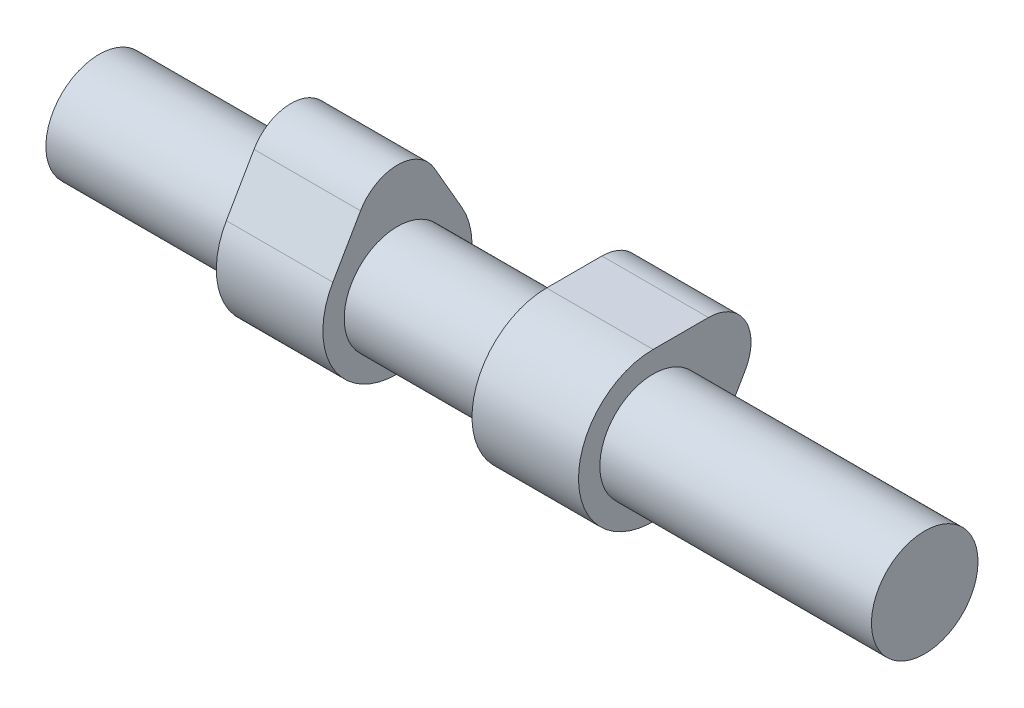
ISO-10303-21;
HEADER;
FILE_DESCRIPTION(('STEP AP214'),'2;1');
FILE_NAME('part.step','',(''),(''),'','','');
FILE_SCHEMA(('AUTOMOTIVE_DESIGN { 1 0 10303 214 1 1 1 1 }'));
ENDSEC;
DATA;
#1=APPLICATION_CONTEXT('core data for automotive mechanical design processes');
#2=APPLICATION_PROTOCOL_DEFINITION('international standard','automotive_design',2000,#1);
#3=PRODUCT_CONTEXT('',#1,'mechanical');
#4=PRODUCT('Part','Part','',(#3));
#5=PRODUCT_RELATED_PRODUCT_CATEGORY('part','',(#4));
#6=PRODUCT_DEFINITION_FORMATION('','',#4);
#7=PRODUCT_DEFINITION_CONTEXT('part definition',#1,'design');
#8=PRODUCT_DEFINITION('design','',#6,#7);
#9=PRODUCT_DEFINITION_SHAPE('','',#8);
#10=(LENGTH_UNIT() NAMED_UNIT(*) SI_UNIT(.MILLI.,.METRE.));
#11=(NAMED_UNIT(*) PLANE_ANGLE_UNIT() SI_UNIT($,.RADIAN.));
#12=(NAMED_UNIT(*) SI_UNIT($,.STERADIAN.) SOLID_ANGLE_UNIT());
#13=UNCERTAINTY_MEASURE_WITH_UNIT(LENGTH_MEASURE(1.E-05),#10,'distance_accuracy_value','');
#14=(GEOMETRIC_REPRESENTATION_CONTEXT(3) GLOBAL_UNCERTAINTY_ASSIGNED_CONTEXT((#13)) GLOBAL_UNIT_ASSIGNED_CONTEXT((#10,
#11,#12)) REPRESENTATION_CONTEXT('',''));
#15=CARTESIAN_POINT('',(0.,0.,0.));
#16=DIRECTION('',(0.,0.,1.));
#17=DIRECTION('',(1.,0.,0.));
#18=AXIS2_PLACEMENT_3D('',#15,#16,#17);
#19=CARTESIAN_POINT('',(-52.,0.,0.));
#20=DIRECTION('',(1.,0.,0.));
#21=DIRECTION('',(0.,0.,-1.));
#22=AXIS2_PLACEMENT_3D('',#19,#20,#21);
#23=CYLINDRICAL_SURFACE('',#22,5.);
#24=CARTESIAN_POINT('',(0.,0.,0.));
#25=DIRECTION('',(1.,0.,0.));
#26=DIRECTION('',(0.,0.,-1.));
#27=AXIS2_PLACEMENT_3D('',#24,#25,#26);
#28=CIRCLE('',#27,5.);
#29=CARTESIAN_POINT('',(0.,0.,-5.));
#30=VERTEX_POINT('',#29);
#31=EDGE_CURVE('E169',#30,#30,#28,.T.);
#32=ORIENTED_EDGE('',*,*,#31,.T.);
#33=EDGE_LOOP('',(#32));
#34=FACE_BOUND('',#33,.T.);
#35=CARTESIAN_POINT('',(25.5,0.,0.));
#36=DIRECTION('',(1.,0.,0.));
#37=DIRECTION('',(0.,0.,-1.));
#38=AXIS2_PLACEMENT_3D('',#35,#36,#37);
#39=CIRCLE('',#38,5.);
#40=CARTESIAN_POINT('',(25.5,0.,-5.));
#41=VERTEX_POINT('',#40);
#42=EDGE_CURVE('E151',#41,#41,#39,.T.);
#43=ORIENTED_EDGE('',*,*,#42,.F.);
#44=EDGE_LOOP('',(#43));
#45=FACE_BOUND('',#44,.T.);
#46=ADVANCED_FACE('F41',(#34,#45),#23,.T.);
#47=CARTESIAN_POINT('',(-10.,-3.50000000000002,-6.06217782649106));
#48=DIRECTION('',(0.,-0.500000000000002,-0.866025403784437));
#49=DIRECTION('',(0.,0.866025403784437,-0.500000000000002));
#50=AXIS2_PLACEMENT_3D('',#47,#48,#49);
#51=PLANE('',#50);
#52=DIRECTION('',(0.,0.866025403784437,-0.500000000000002));
#53=VECTOR('',#52,1.);
#54=CARTESIAN_POINT('',(0.,-3.50000000000002,-6.06217782649106));
#55=LINE('',#54,#53);
#56=CARTESIAN_POINT('',(0.,-3.50000000000001,-6.06217782649106));
#57=VERTEX_POINT('',#56);
#58=CARTESIAN_POINT('',(0.,0.999999999999979,-8.66025403784439));
#59=VERTEX_POINT('',#58);
#60=EDGE_CURVE('E179',#57,#59,#55,.T.);
#61=ORIENTED_EDGE('',*,*,#60,.F.);
#62=DIRECTION('',(1.,0.,0.));
#63=VECTOR('',#62,1.);
#64=CARTESIAN_POINT('',(-10.,-3.50000000000001,-6.06217782649106));
#65=LINE('',#64,#63);
#66=CARTESIAN_POINT('',(-10.,-3.50000000000001,-6.06217782649106));
#67=VERTEX_POINT('',#66);
#68=EDGE_CURVE('E49',#67,#57,#65,.T.);
#69=ORIENTED_EDGE('',*,*,#68,.F.);
#70=DIRECTION('',(0.,0.866025403784437,-0.500000000000002));
#71=VECTOR('',#70,1.);
#72=CARTESIAN_POINT('',(-10.,-3.50000000000002,-6.06217782649106));
#73=LINE('',#72,#71);
#74=CARTESIAN_POINT('',(-10.,0.999999999999979,-8.66025403784439));
#75=VERTEX_POINT('',#74);
#76=EDGE_CURVE('E166',#67,#75,#73,.T.);
#77=ORIENTED_EDGE('',*,*,#76,.T.);
#78=DIRECTION('',(1.,0.,0.));
#79=VECTOR('',#78,1.);
#80=CARTESIAN_POINT('',(-10.,0.999999999999979,-8.66025403784439));
#81=LINE('',#80,#79);
#82=EDGE_CURVE('E88',#75,#59,#81,.T.);
#83=ORIENTED_EDGE('',*,*,#82,.T.);
#84=EDGE_LOOP('',(#61,#69,#77,#83));
#85=FACE_BOUND('',#84,.T.);
#86=ADVANCED_FACE('F43',(#85),#51,.T.);
#87=CARTESIAN_POINT('',(-10.,0.,0.));
#88=DIRECTION('',(1.,0.,0.));
#89=DIRECTION('',(0.,0.,-1.));
#90=AXIS2_PLACEMENT_3D('',#87,#88,#89);
#91=CYLINDRICAL_SURFACE('',#90,7.);
#92=CARTESIAN_POINT('',(0.,0.,0.));
#93=DIRECTION('',(1.,0.,0.));
#94=DIRECTION('',(0.,0.,-1.));
#95=AXIS2_PLACEMENT_3D('',#92,#93,#94);
#96=CIRCLE('',#95,7.);
#97=CARTESIAN_POINT('',(0.,7.,0.));
#98=VERTEX_POINT('',#97);
#99=EDGE_CURVE('E171',#98,#57,#96,.T.);
#100=ORIENTED_EDGE('',*,*,#99,.F.);
#101=DIRECTION('',(1.,0.,0.));
#102=VECTOR('',#101,1.);
#103=CARTESIAN_POINT('',(-10.,7.,0.));
#104=LINE('',#103,#102);
#105=CARTESIAN_POINT('',(-10.,7.,0.));
#106=VERTEX_POINT('',#105);
#107=EDGE_CURVE('E73',#106,#98,#104,.T.);
#108=ORIENTED_EDGE('',*,*,#107,.F.);
#109=CARTESIAN_POINT('',(-10.,0.,0.));
#110=DIRECTION('',(1.,0.,0.));
#111=DIRECTION('',(0.,0.,-1.));
#112=AXIS2_PLACEMENT_3D('',#109,#110,#111);
#113=CIRCLE('',#112,7.);
#114=EDGE_CURVE('E176',#106,#67,#113,.T.);
#115=ORIENTED_EDGE('',*,*,#114,.T.);
#116=ORIENTED_EDGE('',*,*,#68,.T.);
#117=EDGE_LOOP('',(#100,#108,#115,#116));
#118=FACE_BOUND('',#117,.T.);
#119=ADVANCED_FACE('F197',(#118),#91,.T.);
#120=CARTESIAN_POINT('',(-10.,7.,0.));
#121=DIRECTION('',(0.,-1.,0.));
#122=DIRECTION('',(0.,0.,-1.));
#123=AXIS2_PLACEMENT_3D('',#120,#121,#122);
#124=PLANE('',#123);
#125=DIRECTION('',(0.,0.,-1.));
#126=VECTOR('',#125,1.);
#127=CARTESIAN_POINT('',(0.,7.,0.));
#128=LINE('',#127,#126);
#129=CARTESIAN_POINT('',(0.,6.99999999999999,-5.19615242270665));
#130=VERTEX_POINT('',#129);
#131=EDGE_CURVE('E189',#98,#130,#128,.T.);
#132=ORIENTED_EDGE('',*,*,#131,.T.);
#133=DIRECTION('',(1.,0.,0.));
#134=VECTOR('',#133,1.);
#135=CARTESIAN_POINT('',(-10.,6.99999999999999,-5.19615242270665));
#136=LINE('',#135,#134);
#137=CARTESIAN_POINT('',(-10.,6.99999999999999,-5.19615242270665));
#138=VERTEX_POINT('',#137);
#139=EDGE_CURVE('E195',#138,#130,#136,.T.);
#140=ORIENTED_EDGE('',*,*,#139,.F.);
#141=DIRECTION('',(0.,0.,-1.));
#142=VECTOR('',#141,1.);
#143=CARTESIAN_POINT('',(-10.,7.,0.));
#144=LINE('',#143,#142);
#145=EDGE_CURVE('E173',#106,#138,#144,.T.);
#146=ORIENTED_EDGE('',*,*,#145,.F.);
#147=ORIENTED_EDGE('',*,*,#107,.T.);
#148=EDGE_LOOP('',(#132,#140,#146,#147));
#149=FACE_BOUND('',#148,.T.);
#150=ADVANCED_FACE('F200',(#149),#124,.F.);
#151=CARTESIAN_POINT('',(-10.,2.99999999999999,-5.19615242270664));
#152=DIRECTION('',(1.,0.,0.));
#153=DIRECTION('',(0.,0.,-1.));
#154=AXIS2_PLACEMENT_3D('',#151,#152,#153);
#155=CYLINDRICAL_SURFACE('',#154,4.);
#156=CARTESIAN_POINT('',(0.,2.99999999999999,-5.19615242270664));
#157=DIRECTION('',(1.,0.,0.));
#158=DIRECTION('',(0.,0.,-1.));
#159=AXIS2_PLACEMENT_3D('',#156,#157,#158);
#160=CIRCLE('',#159,4.);
#161=EDGE_CURVE('E181',#59,#130,#160,.T.);
#162=ORIENTED_EDGE('',*,*,#161,.F.);
#163=ORIENTED_EDGE('',*,*,#82,.F.);
#164=CARTESIAN_POINT('',(-10.,2.99999999999999,-5.19615242270664));
#165=DIRECTION('',(1.,0.,0.));
#166=DIRECTION('',(0.,0.,-1.));
#167=AXIS2_PLACEMENT_3D('',#164,#165,#166);
#168=CIRCLE('',#167,4.);
#169=EDGE_CURVE('E174',#75,#138,#168,.T.);
#170=ORIENTED_EDGE('',*,*,#169,.T.);
#171=ORIENTED_EDGE('',*,*,#139,.T.);
#172=EDGE_LOOP('',(#162,#163,#170,#171));
#173=FACE_BOUND('',#172,.T.);
#174=ADVANCED_FACE('F193',(#173),#155,.T.);
#175=CARTESIAN_POINT('',(-10.,0.,0.));
#176=DIRECTION('',(1.,0.,0.));
#177=DIRECTION('',(0.,0.,-1.));
#178=AXIS2_PLACEMENT_3D('',#175,#176,#177);
#179=PLANE('',#178);
#180=CARTESIAN_POINT('',(-10.,0.,0.));
#181=DIRECTION('',(1.,0.,0.));
#182=DIRECTION('',(0.,0.,-1.));
#183=AXIS2_PLACEMENT_3D('',#180,#181,#182);
#184=CIRCLE('',#183,5.);
#185=CARTESIAN_POINT('',(-10.,0.,-5.));
#186=VERTEX_POINT('',#185);
#187=EDGE_CURVE('E164',#186,#186,#184,.T.);
#188=ORIENTED_EDGE('',*,*,#187,.T.);
#189=EDGE_LOOP('',(#188));
#190=FACE_BOUND('',#189,.T.);
#191=ORIENTED_EDGE('',*,*,#76,.F.);
#192=ORIENTED_EDGE('',*,*,#114,.F.);
#193=ORIENTED_EDGE('',*,*,#145,.T.);
#194=ORIENTED_EDGE('',*,*,#169,.F.);
#195=EDGE_LOOP('',(#191,#192,#193,#194));
#196=FACE_BOUND('',#195,.T.);
#197=ADVANCED_FACE('F203',(#190,#196),#179,.F.);
#198=CARTESIAN_POINT('',(0.,0.,0.));
#199=DIRECTION('',(1.,0.,0.));
#200=DIRECTION('',(0.,0.,-1.));
#201=AXIS2_PLACEMENT_3D('',#198,#199,#200);
#202=PLANE('',#201);
#203=ORIENTED_EDGE('',*,*,#31,.F.);
#204=EDGE_LOOP('',(#203));
#205=FACE_BOUND('',#204,.T.);
#206=ORIENTED_EDGE('',*,*,#60,.T.);
#207=ORIENTED_EDGE('',*,*,#161,.T.);
#208=ORIENTED_EDGE('',*,*,#131,.F.);
#209=ORIENTED_EDGE('',*,*,#99,.T.);
#210=EDGE_LOOP('',(#206,#207,#208,#209));
#211=FACE_BOUND('',#210,.T.);
#212=ADVANCED_FACE('F198',(#205,#211),#202,.T.);
#213=CARTESIAN_POINT('',(-24.,0.,0.));
#214=DIRECTION('',(1.,0.,0.));
#215=DIRECTION('',(0.,0.,-1.));
#216=AXIS2_PLACEMENT_3D('',#213,#214,#215);
#217=CIRCLE('',#216,5.);
#218=CARTESIAN_POINT('',(-24.,0.,-5.));
#219=VERTEX_POINT('',#218);
#220=EDGE_CURVE('E11',#219,#219,#217,.F.);
#221=ORIENTED_EDGE('',*,*,#220,.F.);
#222=EDGE_LOOP('',(#221));
#223=FACE_BOUND('',#222,.T.);
#224=ORIENTED_EDGE('',*,*,#187,.F.);
#225=EDGE_LOOP('',(#224));
#226=FACE_BOUND('',#225,.T.);
#227=ADVANCED_FACE('F207',(#223,#226),#23,.T.);
#228=CARTESIAN_POINT('',(-34.,3.5,-6.06217782649107));
#229=DIRECTION('',(0.,0.5,-0.866025403784439));
#230=DIRECTION('',(0.,0.866025403784439,0.5));
#231=AXIS2_PLACEMENT_3D('',#228,#229,#230);
#232=PLANE('',#231);
#233=DIRECTION('',(0.,0.866025403784439,0.5));
#234=VECTOR('',#233,1.);
#235=CARTESIAN_POINT('',(-24.,3.5,-6.06217782649107));
#236=LINE('',#235,#234);
#237=CARTESIAN_POINT('',(-24.,3.5,-6.06217782649107));
#238=VERTEX_POINT('',#237);
#239=CARTESIAN_POINT('',(-24.,8.,-3.46410161513776));
#240=VERTEX_POINT('',#239);
#241=EDGE_CURVE('E149',#238,#240,#236,.T.);
#242=ORIENTED_EDGE('',*,*,#241,.F.);
#243=DIRECTION('',(1.,0.,0.));
#244=VECTOR('',#243,1.);
#245=CARTESIAN_POINT('',(-34.,3.5,-6.06217782649107));
#246=LINE('',#245,#244);
#247=CARTESIAN_POINT('',(-34.,3.5,-6.06217782649107));
#248=VERTEX_POINT('',#247);
#249=EDGE_CURVE('E137',#248,#238,#246,.T.);
#250=ORIENTED_EDGE('',*,*,#249,.F.);
#251=DIRECTION('',(0.,0.866025403784439,0.5));
#252=VECTOR('',#251,1.);
#253=CARTESIAN_POINT('',(-34.,3.5,-6.06217782649107));
#254=LINE('',#253,#252);
#255=CARTESIAN_POINT('',(-34.,8.,-3.46410161513776));
#256=VERTEX_POINT('',#255);
#257=EDGE_CURVE('E131',#248,#256,#254,.T.);
#258=ORIENTED_EDGE('',*,*,#257,.T.);
#259=DIRECTION('',(1.,0.,0.));
#260=VECTOR('',#259,1.);
#261=CARTESIAN_POINT('',(-34.,8.,-3.46410161513776));
#262=LINE('',#261,#260);
#263=EDGE_CURVE('E113',#256,#240,#262,.T.);
#264=ORIENTED_EDGE('',*,*,#263,.T.);
#265=EDGE_LOOP('',(#242,#250,#258,#264));
#266=FACE_BOUND('',#265,.T.);
#267=ADVANCED_FACE('F138',(#266),#232,.T.);
#268=CARTESIAN_POINT('',(-34.,0.,0.));
#269=DIRECTION('',(1.,0.,0.));
#270=DIRECTION('',(0.,0.86602540378444,-0.499999999999998));
#271=AXIS2_PLACEMENT_3D('',#268,#269,#270);
#272=CYLINDRICAL_SURFACE('',#271,7.);
#273=CARTESIAN_POINT('',(-24.,0.,0.));
#274=DIRECTION('',(1.,0.,0.));
#275=DIRECTION('',(0.,0.86602540378444,-0.499999999999998));
#276=AXIS2_PLACEMENT_3D('',#273,#274,#275);
#277=CIRCLE('',#276,7.);
#278=CARTESIAN_POINT('',(-24.,3.5,6.06217782649107));
#279=VERTEX_POINT('',#278);
#280=EDGE_CURVE('E141',#279,#238,#277,.T.);
#281=ORIENTED_EDGE('',*,*,#280,.F.);
#282=DIRECTION('',(1.,0.,0.));
#283=VECTOR('',#282,1.);
#284=CARTESIAN_POINT('',(-34.,3.5,6.06217782649107));
#285=LINE('',#284,#283);
#286=CARTESIAN_POINT('',(-34.,3.5,6.06217782649107));
#287=VERTEX_POINT('',#286);
#288=EDGE_CURVE('E159',#287,#279,#285,.T.);
#289=ORIENTED_EDGE('',*,*,#288,.F.);
#290=CARTESIAN_POINT('',(-34.,0.,0.));
#291=DIRECTION('',(1.,0.,0.));
#292=DIRECTION('',(0.,0.86602540378444,-0.499999999999998));
#293=AXIS2_PLACEMENT_3D('',#290,#291,#292);
#294=CIRCLE('',#293,7.);
#295=EDGE_CURVE('E127',#287,#248,#294,.T.);
#296=ORIENTED_EDGE('',*,*,#295,.T.);
#297=ORIENTED_EDGE('',*,*,#249,.T.);
#298=EDGE_LOOP('',(#281,#289,#296,#297));
#299=FACE_BOUND('',#298,.T.);
#300=ADVANCED_FACE('F231',(#299),#272,.T.);
#301=CARTESIAN_POINT('',(-34.,3.5,6.06217782649107));
#302=DIRECTION('',(0.,-0.5,-0.866025403784439));
#303=DIRECTION('',(0.,0.866025403784439,-0.5));
#304=AXIS2_PLACEMENT_3D('',#301,#302,#303);
#305=PLANE('',#304);
#306=DIRECTION('',(0.,0.866025403784439,-0.5));
#307=VECTOR('',#306,1.);
#308=CARTESIAN_POINT('',(-24.,3.5,6.06217782649107));
#309=LINE('',#308,#307);
#310=CARTESIAN_POINT('',(-24.,8.,3.46410161513776));
#311=VERTEX_POINT('',#310);
#312=EDGE_CURVE('E153',#279,#311,#309,.T.);
#313=ORIENTED_EDGE('',*,*,#312,.T.);
#314=DIRECTION('',(1.,0.,0.));
#315=VECTOR('',#314,1.);
#316=CARTESIAN_POINT('',(-34.,8.,3.46410161513776));
#317=LINE('',#316,#315);
#318=CARTESIAN_POINT('',(-34.,8.,3.46410161513776));
#319=VERTEX_POINT('',#318);
#320=EDGE_CURVE('E124',#319,#311,#317,.T.);
#321=ORIENTED_EDGE('',*,*,#320,.F.);
#322=DIRECTION('',(0.,0.866025403784439,-0.5));
#323=VECTOR('',#322,1.);
#324=CARTESIAN_POINT('',(-34.,3.5,6.06217782649107));
#325=LINE('',#324,#323);
#326=EDGE_CURVE('E132',#287,#319,#325,.T.);
#327=ORIENTED_EDGE('',*,*,#326,.F.);
#328=ORIENTED_EDGE('',*,*,#288,.T.);
#329=EDGE_LOOP('',(#313,#321,#327,#328));
#330=FACE_BOUND('',#329,.T.);
#331=ADVANCED_FACE('F242',(#330),#305,.F.);
#332=CARTESIAN_POINT('',(-34.,6.,0.));
#333=DIRECTION('',(1.,0.,0.));
#334=DIRECTION('',(0.,0.86602540378444,-0.499999999999998));
#335=AXIS2_PLACEMENT_3D('',#332,#333,#334);
#336=CYLINDRICAL_SURFACE('',#335,4.);
#337=CARTESIAN_POINT('',(-24.,6.,0.));
#338=DIRECTION('',(1.,0.,0.));
#339=DIRECTION('',(0.,0.86602540378444,-0.499999999999998));
#340=AXIS2_PLACEMENT_3D('',#337,#338,#339);
#341=CIRCLE('',#340,4.);
#342=EDGE_CURVE('E117',#240,#311,#341,.T.);
#343=ORIENTED_EDGE('',*,*,#342,.F.);
#344=ORIENTED_EDGE('',*,*,#263,.F.);
#345=CARTESIAN_POINT('',(-34.,6.,0.));
#346=DIRECTION('',(1.,0.,0.));
#347=DIRECTION('',(0.,0.86602540378444,-0.499999999999998));
#348=AXIS2_PLACEMENT_3D('',#345,#346,#347);
#349=CIRCLE('',#348,4.);
#350=EDGE_CURVE('E120',#256,#319,#349,.T.);
#351=ORIENTED_EDGE('',*,*,#350,.T.);
#352=ORIENTED_EDGE('',*,*,#320,.T.);
#353=EDGE_LOOP('',(#343,#344,#351,#352));
#354=FACE_BOUND('',#353,.T.);
#355=ADVANCED_FACE('F116',(#354),#336,.T.);
#356=CARTESIAN_POINT('',(-34.,0.,0.));
#357=DIRECTION('',(1.,0.,0.));
#358=DIRECTION('',(0.,0.86602540378444,-0.499999999999998));
#359=AXIS2_PLACEMENT_3D('',#356,#357,#358);
#360=PLANE('',#359);
#361=CARTESIAN_POINT('',(-34.,0.,0.));
#362=DIRECTION('',(1.,0.,0.));
#363=DIRECTION('',(0.,0.86602540378444,-0.499999999999998));
#364=AXIS2_PLACEMENT_3D('',#361,#362,#363);
#365=CIRCLE('',#364,5.);
#366=CARTESIAN_POINT('',(-34.,4.3301270189222,-2.49999999999999));
#367=VERTEX_POINT('',#366);
#368=EDGE_CURVE('E139',#367,#367,#365,.T.);
#369=ORIENTED_EDGE('',*,*,#368,.T.);
#370=EDGE_LOOP('',(#369));
#371=FACE_BOUND('',#370,.T.);
#372=ORIENTED_EDGE('',*,*,#257,.F.);
#373=ORIENTED_EDGE('',*,*,#295,.F.);
#374=ORIENTED_EDGE('',*,*,#326,.T.);
#375=ORIENTED_EDGE('',*,*,#350,.F.);
#376=EDGE_LOOP('',(#372,#373,#374,#375));
#377=FACE_BOUND('',#376,.T.);
#378=ADVANCED_FACE('F128',(#371,#377),#360,.F.);
#379=CARTESIAN_POINT('',(-24.,0.,0.));
#380=DIRECTION('',(1.,0.,0.));
#381=DIRECTION('',(0.,0.86602540378444,-0.499999999999998));
#382=AXIS2_PLACEMENT_3D('',#379,#380,#381);
#383=PLANE('',#382);
#384=ORIENTED_EDGE('',*,*,#220,.T.);
#385=EDGE_LOOP('',(#384));
#386=FACE_BOUND('',#385,.T.);
#387=ORIENTED_EDGE('',*,*,#241,.T.);
#388=ORIENTED_EDGE('',*,*,#342,.T.);
#389=ORIENTED_EDGE('',*,*,#312,.F.);
#390=ORIENTED_EDGE('',*,*,#280,.T.);
#391=EDGE_LOOP('',(#387,#388,#389,#390));
#392=FACE_BOUND('',#391,.T.);
#393=ADVANCED_FACE('F240',(#386,#392),#383,.T.);
#394=CARTESIAN_POINT('',(-52.,0.,0.));
#395=DIRECTION('',(1.,0.,0.));
#396=DIRECTION('',(0.,0.,-1.));
#397=AXIS2_PLACEMENT_3D('',#394,#395,#396);
#398=PLANE('',#397);
#399=CARTESIAN_POINT('',(-52.,0.,0.));
#400=DIRECTION('',(1.,0.,0.));
#401=DIRECTION('',(0.,0.,-1.));
#402=AXIS2_PLACEMENT_3D('',#399,#400,#401);
#403=CIRCLE('',#402,5.);
#404=CARTESIAN_POINT('',(-52.,0.,-5.));
#405=VERTEX_POINT('',#404);
#406=EDGE_CURVE('E157',#405,#405,#403,.T.);
#407=ORIENTED_EDGE('',*,*,#406,.F.);
#408=EDGE_LOOP('',(#407));
#409=FACE_BOUND('',#408,.T.);
#410=ADVANCED_FACE('F221',(#409),#398,.F.);
#411=ORIENTED_EDGE('',*,*,#406,.T.);
#412=EDGE_LOOP('',(#411));
#413=FACE_BOUND('',#412,.T.);
#414=ORIENTED_EDGE('',*,*,#368,.F.);
#415=EDGE_LOOP('',(#414));
#416=FACE_BOUND('',#415,.T.);
#417=ADVANCED_FACE('F214',(#413,#416),#23,.T.);
#418=CARTESIAN_POINT('',(25.5,0.,0.));
#419=DIRECTION('',(1.,0.,0.));
#420=DIRECTION('',(0.,0.,-1.));
#421=AXIS2_PLACEMENT_3D('',#418,#419,#420);
#422=PLANE('',#421);
#423=ORIENTED_EDGE('',*,*,#42,.T.);
#424=EDGE_LOOP('',(#423));
#425=FACE_BOUND('',#424,.T.);
#426=ADVANCED_FACE('F224',(#425),#422,.T.);
#427=CLOSED_SHELL('',(#46,#86,#119,#150,#174,#197,#212,#227,#267,#300,#331,#355,#378,#393,#410,
#417,#426));
#428=MANIFOLD_SOLID_BREP('B2',#427);
#429=ADVANCED_BREP_SHAPE_REPRESENTATION('',(#18,#428),#14);
#430=SHAPE_DEFINITION_REPRESENTATION(#9,#429);
ENDSEC;
END-ISO-10303-21;
